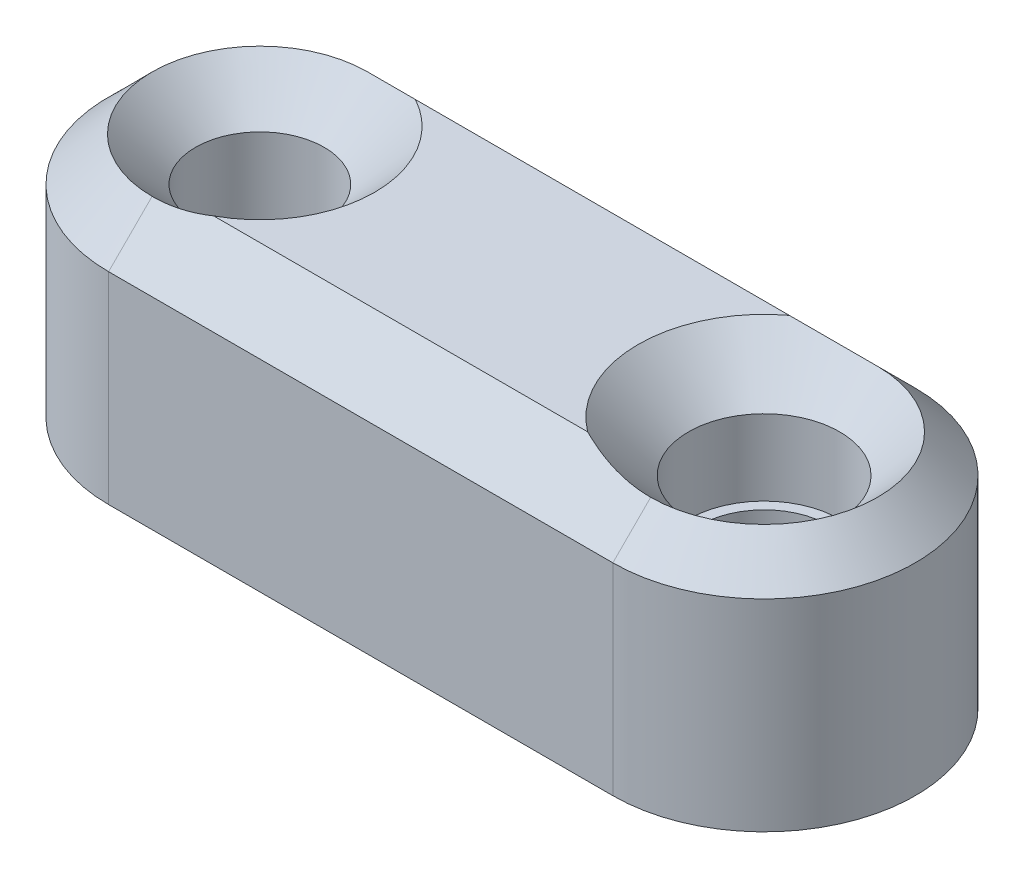
ISO-10303-21;
HEADER;
FILE_DESCRIPTION(('STEP AP214'),'2;1');
FILE_NAME('part.step','',(''),(''),'','','');
FILE_SCHEMA(('AUTOMOTIVE_DESIGN { 1 0 10303 214 1 1 1 1 }'));
ENDSEC;
DATA;
#1=APPLICATION_CONTEXT('core data for automotive mechanical design processes');
#2=APPLICATION_PROTOCOL_DEFINITION('international standard','automotive_design',2000,#1);
#3=PRODUCT_CONTEXT('',#1,'mechanical');
#4=PRODUCT('Part','Part','',(#3));
#5=PRODUCT_RELATED_PRODUCT_CATEGORY('part','',(#4));
#6=PRODUCT_DEFINITION_FORMATION('','',#4);
#7=PRODUCT_DEFINITION_CONTEXT('part definition',#1,'design');
#8=PRODUCT_DEFINITION('design','',#6,#7);
#9=PRODUCT_DEFINITION_SHAPE('','',#8);
#10=(LENGTH_UNIT() NAMED_UNIT(*) SI_UNIT(.MILLI.,.METRE.));
#11=(NAMED_UNIT(*) PLANE_ANGLE_UNIT() SI_UNIT($,.RADIAN.));
#12=(NAMED_UNIT(*) SI_UNIT($,.STERADIAN.) SOLID_ANGLE_UNIT());
#13=UNCERTAINTY_MEASURE_WITH_UNIT(LENGTH_MEASURE(1.E-05),#10,'distance_accuracy_value','');
#14=(GEOMETRIC_REPRESENTATION_CONTEXT(3) GLOBAL_UNCERTAINTY_ASSIGNED_CONTEXT((#13)) GLOBAL_UNIT_ASSIGNED_CONTEXT((#10,
#11,#12)) REPRESENTATION_CONTEXT('',''));
#15=CARTESIAN_POINT('',(0.,0.,0.));
#16=DIRECTION('',(0.,0.,1.));
#17=DIRECTION('',(1.,0.,0.));
#18=AXIS2_PLACEMENT_3D('',#15,#16,#17);
#19=CARTESIAN_POINT('',(0.,10.,0.));
#20=DIRECTION('',(0.,-1.,0.));
#21=DIRECTION('',(0.,0.,-1.));
#22=AXIS2_PLACEMENT_3D('',#19,#20,#21);
#23=CYLINDRICAL_SURFACE('',#22,6.);
#24=DIRECTION('',(0.,-1.,0.));
#25=VECTOR('',#24,1.);
#26=CARTESIAN_POINT('',(0.,10.,6.));
#27=LINE('',#26,#25);
#28=CARTESIAN_POINT('',(0.,7.99999999999999,6.));
#29=VERTEX_POINT('',#28);
#30=CARTESIAN_POINT('',(0.,0.,6.));
#31=VERTEX_POINT('',#30);
#32=EDGE_CURVE('E97',#29,#31,#27,.T.);
#33=ORIENTED_EDGE('',*,*,#32,.F.);
#34=CARTESIAN_POINT('',(0.,7.99999999999999,0.));
#35=DIRECTION('',(0.,1.,0.));
#36=DIRECTION('',(0.,0.,1.));
#37=AXIS2_PLACEMENT_3D('',#34,#35,#36);
#38=CIRCLE('',#37,6.);
#39=CARTESIAN_POINT('',(0.,7.99999999999999,-6.));
#40=VERTEX_POINT('',#39);
#41=EDGE_CURVE('E177',#29,#40,#38,.F.);
#42=ORIENTED_EDGE('',*,*,#41,.T.);
#43=DIRECTION('',(0.,-1.,0.));
#44=VECTOR('',#43,1.);
#45=CARTESIAN_POINT('',(0.,10.,-6.));
#46=LINE('',#45,#44);
#47=CARTESIAN_POINT('',(0.,0.,-6.));
#48=VERTEX_POINT('',#47);
#49=EDGE_CURVE('E153',#40,#48,#46,.T.);
#50=ORIENTED_EDGE('',*,*,#49,.T.);
#51=CARTESIAN_POINT('',(0.,0.,0.));
#52=DIRECTION('',(0.,1.,0.));
#53=DIRECTION('',(0.,0.,1.));
#54=AXIS2_PLACEMENT_3D('',#51,#52,#53);
#55=CIRCLE('',#54,6.);
#56=EDGE_CURVE('E282',#48,#31,#55,.T.);
#57=ORIENTED_EDGE('',*,*,#56,.T.);
#58=EDGE_LOOP('',(#33,#42,#50,#57));
#59=FACE_BOUND('',#58,.T.);
#60=ADVANCED_FACE('F44',(#59),#23,.T.);
#61=CARTESIAN_POINT('',(0.,10.,6.));
#62=DIRECTION('',(0.,0.,-1.));
#63=DIRECTION('',(-1.,0.,0.));
#64=AXIS2_PLACEMENT_3D('',#61,#62,#63);
#65=PLANE('',#64);
#66=DIRECTION('',(0.,-1.,0.));
#67=VECTOR('',#66,1.);
#68=CARTESIAN_POINT('',(20.,10.,6.));
#69=LINE('',#68,#67);
#70=CARTESIAN_POINT('',(20.,7.99999999999999,6.));
#71=VERTEX_POINT('',#70);
#72=CARTESIAN_POINT('',(20.,0.,6.));
#73=VERTEX_POINT('',#72);
#74=EDGE_CURVE('E160',#71,#73,#69,.T.);
#75=ORIENTED_EDGE('',*,*,#74,.F.);
#76=DIRECTION('',(-1.,0.,0.));
#77=VECTOR('',#76,1.);
#78=CARTESIAN_POINT('',(0.,7.99999999999999,6.));
#79=LINE('',#78,#77);
#80=EDGE_CURVE('E71',#71,#29,#79,.T.);
#81=ORIENTED_EDGE('',*,*,#80,.T.);
#82=ORIENTED_EDGE('',*,*,#32,.T.);
#83=DIRECTION('',(1.,0.,0.));
#84=VECTOR('',#83,1.);
#85=CARTESIAN_POINT('',(0.,0.,6.));
#86=LINE('',#85,#84);
#87=EDGE_CURVE('E285',#31,#73,#86,.T.);
#88=ORIENTED_EDGE('',*,*,#87,.T.);
#89=EDGE_LOOP('',(#75,#81,#82,#88));
#90=FACE_BOUND('',#89,.T.);
#91=ADVANCED_FACE('F318',(#90),#65,.F.);
#92=CARTESIAN_POINT('',(20.,10.,0.));
#93=DIRECTION('',(0.,-1.,0.));
#94=DIRECTION('',(0.,0.,-1.));
#95=AXIS2_PLACEMENT_3D('',#92,#93,#94);
#96=CYLINDRICAL_SURFACE('',#95,6.);
#97=DIRECTION('',(0.,-1.,0.));
#98=VECTOR('',#97,1.);
#99=CARTESIAN_POINT('',(20.,10.,-6.));
#100=LINE('',#99,#98);
#101=CARTESIAN_POINT('',(20.,7.99999999999999,-6.));
#102=VERTEX_POINT('',#101);
#103=CARTESIAN_POINT('',(20.,0.,-6.));
#104=VERTEX_POINT('',#103);
#105=EDGE_CURVE('E151',#102,#104,#100,.T.);
#106=ORIENTED_EDGE('',*,*,#105,.F.);
#107=CARTESIAN_POINT('',(20.,7.99999999999999,0.));
#108=DIRECTION('',(0.,1.,0.));
#109=DIRECTION('',(0.,0.,1.));
#110=AXIS2_PLACEMENT_3D('',#107,#108,#109);
#111=CIRCLE('',#110,6.);
#112=EDGE_CURVE('E143',#102,#71,#111,.F.);
#113=ORIENTED_EDGE('',*,*,#112,.T.);
#114=ORIENTED_EDGE('',*,*,#74,.T.);
#115=CARTESIAN_POINT('',(20.,0.,0.));
#116=DIRECTION('',(0.,1.,0.));
#117=DIRECTION('',(0.,0.,1.));
#118=AXIS2_PLACEMENT_3D('',#115,#116,#117);
#119=CIRCLE('',#118,6.);
#120=EDGE_CURVE('E158',#73,#104,#119,.T.);
#121=ORIENTED_EDGE('',*,*,#120,.T.);
#122=EDGE_LOOP('',(#106,#113,#114,#121));
#123=FACE_BOUND('',#122,.T.);
#124=ADVANCED_FACE('F156',(#123),#96,.T.);
#125=CARTESIAN_POINT('',(0.,10.,-6.));
#126=DIRECTION('',(0.,0.,1.));
#127=DIRECTION('',(1.,0.,0.));
#128=AXIS2_PLACEMENT_3D('',#125,#126,#127);
#129=PLANE('',#128);
#130=ORIENTED_EDGE('',*,*,#49,.F.);
#131=DIRECTION('',(1.,0.,0.));
#132=VECTOR('',#131,1.);
#133=CARTESIAN_POINT('',(20.,7.99999999999999,-6.));
#134=LINE('',#133,#132);
#135=EDGE_CURVE('E135',#40,#102,#134,.T.);
#136=ORIENTED_EDGE('',*,*,#135,.T.);
#137=ORIENTED_EDGE('',*,*,#105,.T.);
#138=DIRECTION('',(-1.,0.,0.));
#139=VECTOR('',#138,1.);
#140=CARTESIAN_POINT('',(0.,0.,-6.));
#141=LINE('',#140,#139);
#142=EDGE_CURVE('E163',#104,#48,#141,.T.);
#143=ORIENTED_EDGE('',*,*,#142,.T.);
#144=EDGE_LOOP('',(#130,#136,#137,#143));
#145=FACE_BOUND('',#144,.T.);
#146=ADVANCED_FACE('F149',(#145),#129,.F.);
#147=CARTESIAN_POINT('',(0.,10.,0.));
#148=DIRECTION('',(0.,1.,0.));
#149=DIRECTION('',(0.,0.,1.));
#150=AXIS2_PLACEMENT_3D('',#147,#148,#149);
#151=PLANE('',#150);
#152=DIRECTION('',(-1.,0.,0.));
#153=VECTOR('',#152,1.);
#154=CARTESIAN_POINT('',(0.,10.,-3.99999999999999));
#155=LINE('',#154,#153);
#156=CARTESIAN_POINT('',(17.,10.,-3.99999999999999));
#157=VERTEX_POINT('',#156);
#158=CARTESIAN_POINT('',(2.16852484422016,10.,-3.99999999999999));
#159=VERTEX_POINT('',#158);
#160=EDGE_CURVE('E172',#157,#159,#155,.T.);
#161=ORIENTED_EDGE('',*,*,#160,.T.);
#162=CARTESIAN_POINT('',(0.,10.,0.));
#163=DIRECTION('',(0.,1.,0.));
#164=DIRECTION('',(0.,0.,1.));
#165=AXIS2_PLACEMENT_3D('',#162,#163,#164);
#166=CIRCLE('',#165,4.55);
#167=CARTESIAN_POINT('',(2.16852484422016,10.,3.99999999999999));
#168=VERTEX_POINT('',#167);
#169=EDGE_CURVE('E154',#159,#168,#166,.F.);
#170=ORIENTED_EDGE('',*,*,#169,.T.);
#171=DIRECTION('',(1.,0.,0.));
#172=VECTOR('',#171,1.);
#173=CARTESIAN_POINT('',(20.,10.,3.99999999999999));
#174=LINE('',#173,#172);
#175=CARTESIAN_POINT('',(17.,10.,3.99999999999999));
#176=VERTEX_POINT('',#175);
#177=EDGE_CURVE('E170',#168,#176,#174,.T.);
#178=ORIENTED_EDGE('',*,*,#177,.T.);
#179=CARTESIAN_POINT('',(20.,10.,0.));
#180=DIRECTION('',(0.,1.,0.));
#181=DIRECTION('',(0.,0.,1.));
#182=AXIS2_PLACEMENT_3D('',#179,#180,#181);
#183=CIRCLE('',#182,5.);
#184=EDGE_CURVE('E168',#176,#157,#183,.F.);
#185=ORIENTED_EDGE('',*,*,#184,.T.);
#186=EDGE_LOOP('',(#161,#170,#178,#185));
#187=FACE_BOUND('',#186,.T.);
#188=ADVANCED_FACE('F302',(#187),#151,.T.);
#189=CARTESIAN_POINT('',(0.,0.,0.));
#190=DIRECTION('',(0.,1.,0.));
#191=DIRECTION('',(0.,0.,1.));
#192=AXIS2_PLACEMENT_3D('',#189,#190,#191);
#193=PLANE('',#192);
#194=DIRECTION('',(1.,0.,0.));
#195=VECTOR('',#194,1.);
#196=CARTESIAN_POINT('',(-2.10732848254214,0.,-3.65));
#197=LINE('',#196,#195);
#198=CARTESIAN_POINT('',(-2.10732848254214,0.,-3.65));
#199=VERTEX_POINT('',#198);
#200=CARTESIAN_POINT('',(2.10732848254213,0.,-3.65));
#201=VERTEX_POINT('',#200);
#202=EDGE_CURVE('E578',#199,#201,#197,.T.);
#203=ORIENTED_EDGE('',*,*,#202,.F.);
#204=DIRECTION('',(0.5,0.,-0.866025403784439));
#205=VECTOR('',#204,1.);
#206=CARTESIAN_POINT('',(-4.21465696508427,0.,0.));
#207=LINE('',#206,#205);
#208=CARTESIAN_POINT('',(-4.21465696508427,0.,0.));
#209=VERTEX_POINT('',#208);
#210=EDGE_CURVE('E62',#209,#199,#207,.T.);
#211=ORIENTED_EDGE('',*,*,#210,.F.);
#212=DIRECTION('',(-0.5,0.,-0.866025403784439));
#213=VECTOR('',#212,1.);
#214=CARTESIAN_POINT('',(-2.10732848254213,0.,3.65));
#215=LINE('',#214,#213);
#216=CARTESIAN_POINT('',(-2.10732848254213,0.,3.65));
#217=VERTEX_POINT('',#216);
#218=EDGE_CURVE('E561',#217,#209,#215,.T.);
#219=ORIENTED_EDGE('',*,*,#218,.F.);
#220=DIRECTION('',(-1.,0.,0.));
#221=VECTOR('',#220,1.);
#222=CARTESIAN_POINT('',(2.10732848254214,0.,3.65));
#223=LINE('',#222,#221);
#224=CARTESIAN_POINT('',(2.10732848254214,0.,3.65));
#225=VERTEX_POINT('',#224);
#226=EDGE_CURVE('E566',#225,#217,#223,.T.);
#227=ORIENTED_EDGE('',*,*,#226,.F.);
#228=DIRECTION('',(-0.5,0.,0.866025403784439));
#229=VECTOR('',#228,1.);
#230=CARTESIAN_POINT('',(4.21465696508427,0.,0.));
#231=LINE('',#230,#229);
#232=CARTESIAN_POINT('',(4.21465696508427,0.,0.));
#233=VERTEX_POINT('',#232);
#234=EDGE_CURVE('E584',#233,#225,#231,.T.);
#235=ORIENTED_EDGE('',*,*,#234,.F.);
#236=DIRECTION('',(0.5,0.,0.866025403784439));
#237=VECTOR('',#236,1.);
#238=CARTESIAN_POINT('',(2.10732848254213,0.,-3.65));
#239=LINE('',#238,#237);
#240=EDGE_CURVE('E581',#201,#233,#239,.T.);
#241=ORIENTED_EDGE('',*,*,#240,.F.);
#242=EDGE_LOOP('',(#203,#211,#219,#227,#235,#241));
#243=FACE_BOUND('',#242,.T.);
#244=CARTESIAN_POINT('',(20.,0.,0.));
#245=DIRECTION('',(0.,1.,0.));
#246=DIRECTION('',(0.,0.,1.));
#247=AXIS2_PLACEMENT_3D('',#244,#245,#246);
#248=CIRCLE('',#247,2.575);
#249=CARTESIAN_POINT('',(20.,0.,2.575));
#250=VERTEX_POINT('',#249);
#251=EDGE_CURVE('E275',#250,#250,#248,.T.);
#252=ORIENTED_EDGE('',*,*,#251,.T.);
#253=EDGE_LOOP('',(#252));
#254=FACE_BOUND('',#253,.T.);
#255=ORIENTED_EDGE('',*,*,#56,.F.);
#256=ORIENTED_EDGE('',*,*,#142,.F.);
#257=ORIENTED_EDGE('',*,*,#120,.F.);
#258=ORIENTED_EDGE('',*,*,#87,.F.);
#259=EDGE_LOOP('',(#255,#256,#257,#258));
#260=FACE_BOUND('',#259,.T.);
#261=ADVANCED_FACE('F289',(#243,#254,#260),#193,.F.);
#262=CARTESIAN_POINT('',(0.,0.,0.));
#263=DIRECTION('',(0.,-1.,0.));
#264=DIRECTION('',(0.,0.,-1.));
#265=AXIS2_PLACEMENT_3D('',#262,#263,#264);
#266=CYLINDRICAL_SURFACE('',#265,2.55);
#267=CARTESIAN_POINT('',(0.,7.99999999999999,0.));
#268=DIRECTION('',(0.,1.,0.));
#269=DIRECTION('',(0.,0.,1.));
#270=AXIS2_PLACEMENT_3D('',#267,#268,#269);
#271=CIRCLE('',#270,2.55);
#272=CARTESIAN_POINT('',(0.,7.99999999999999,2.55));
#273=VERTEX_POINT('',#272);
#274=EDGE_CURVE('E54',#273,#273,#271,.T.);
#275=ORIENTED_EDGE('',*,*,#274,.T.);
#276=EDGE_LOOP('',(#275));
#277=FACE_BOUND('',#276,.T.);
#278=CARTESIAN_POINT('',(0.,5.,0.));
#279=DIRECTION('',(0.,-1.,0.));
#280=DIRECTION('',(0.,0.,-1.));
#281=AXIS2_PLACEMENT_3D('',#278,#279,#280);
#282=CIRCLE('',#281,2.55);
#283=CARTESIAN_POINT('',(0.,5.,-2.55));
#284=VERTEX_POINT('',#283);
#285=EDGE_CURVE('E184',#284,#284,#282,.T.);
#286=ORIENTED_EDGE('',*,*,#285,.T.);
#287=EDGE_LOOP('',(#286));
#288=FACE_BOUND('',#287,.T.);
#289=ADVANCED_FACE('F312',(#277,#288),#266,.F.);
#290=CARTESIAN_POINT('',(20.,10.,0.));
#291=DIRECTION('',(0.,1.,0.));
#292=DIRECTION('',(0.,0.,1.));
#293=AXIS2_PLACEMENT_3D('',#290,#291,#292);
#294=CYLINDRICAL_SURFACE('',#293,2.575);
#295=ORIENTED_EDGE('',*,*,#251,.F.);
#296=EDGE_LOOP('',(#295));
#297=FACE_BOUND('',#296,.T.);
#298=CARTESIAN_POINT('',(20.,5.,0.));
#299=DIRECTION('',(0.,1.,0.));
#300=DIRECTION('',(0.,0.,1.));
#301=AXIS2_PLACEMENT_3D('',#298,#299,#300);
#302=CIRCLE('',#301,2.575);
#303=CARTESIAN_POINT('',(20.,5.,2.575));
#304=VERTEX_POINT('',#303);
#305=EDGE_CURVE('E270',#304,#304,#302,.T.);
#306=ORIENTED_EDGE('',*,*,#305,.T.);
#307=EDGE_LOOP('',(#306));
#308=FACE_BOUND('',#307,.T.);
#309=ADVANCED_FACE('F357',(#297,#308),#294,.F.);
#310=CARTESIAN_POINT('',(17.425,5.,0.));
#311=DIRECTION('',(0.,-1.,0.));
#312=DIRECTION('',(0.,0.,-1.));
#313=AXIS2_PLACEMENT_3D('',#310,#311,#312);
#314=PLANE('',#313);
#315=ORIENTED_EDGE('',*,*,#305,.F.);
#316=EDGE_LOOP('',(#315));
#317=FACE_BOUND('',#316,.T.);
#318=CARTESIAN_POINT('',(20.,5.,0.));
#319=DIRECTION('',(0.,1.,0.));
#320=DIRECTION('',(0.,0.,1.));
#321=AXIS2_PLACEMENT_3D('',#318,#319,#320);
#322=CIRCLE('',#321,3.);
#323=CARTESIAN_POINT('',(20.,5.,3.));
#324=VERTEX_POINT('',#323);
#325=EDGE_CURVE('E268',#324,#324,#322,.T.);
#326=ORIENTED_EDGE('',*,*,#325,.T.);
#327=EDGE_LOOP('',(#326));
#328=FACE_BOUND('',#327,.T.);
#329=ADVANCED_FACE('F368',(#317,#328),#314,.F.);
#330=CARTESIAN_POINT('',(20.,10.,0.));
#331=DIRECTION('',(0.,1.,0.));
#332=DIRECTION('',(0.,0.,1.));
#333=AXIS2_PLACEMENT_3D('',#330,#331,#332);
#334=CYLINDRICAL_SURFACE('',#333,3.);
#335=CARTESIAN_POINT('',(20.,8.,0.));
#336=DIRECTION('',(0.,1.,0.));
#337=DIRECTION('',(0.,0.,1.));
#338=AXIS2_PLACEMENT_3D('',#335,#336,#337);
#339=CIRCLE('',#338,3.);
#340=CARTESIAN_POINT('',(20.,8.,3.));
#341=VERTEX_POINT('',#340);
#342=EDGE_CURVE('E11',#341,#341,#339,.T.);
#343=ORIENTED_EDGE('',*,*,#342,.T.);
#344=EDGE_LOOP('',(#343));
#345=FACE_BOUND('',#344,.T.);
#346=ORIENTED_EDGE('',*,*,#325,.F.);
#347=EDGE_LOOP('',(#346));
#348=FACE_BOUND('',#347,.T.);
#349=ADVANCED_FACE('F241',(#345,#348),#334,.F.);
#350=CARTESIAN_POINT('',(0.,10.,3.99999999999999));
#351=DIRECTION('',(0.,0.707106781186546,0.707106781186549));
#352=DIRECTION('',(-1.,0.,0.));
#353=AXIS2_PLACEMENT_3D('',#350,#351,#352);
#354=PLANE('',#353);
#355=DIRECTION('',(0.,0.707106781186549,-0.707106781186546));
#356=VECTOR('',#355,1.);
#357=CARTESIAN_POINT('',(0.,7.99999999999999,6.));
#358=LINE('',#357,#356);
#359=CARTESIAN_POINT('',(0.,9.72499999999999,4.275));
#360=VERTEX_POINT('',#359);
#361=EDGE_CURVE('E141',#29,#360,#358,.T.);
#362=ORIENTED_EDGE('',*,*,#361,.F.);
#363=ORIENTED_EDGE('',*,*,#80,.F.);
#364=DIRECTION('',(0.,-0.707106781186549,0.707106781186546));
#365=VECTOR('',#364,1.);
#366=CARTESIAN_POINT('',(20.,10.,3.99999999999999));
#367=LINE('',#366,#365);
#368=CARTESIAN_POINT('',(20.,9.49999999999999,4.5));
#369=VERTEX_POINT('',#368);
#370=EDGE_CURVE('E49',#369,#71,#367,.T.);
#371=ORIENTED_EDGE('',*,*,#370,.F.);
#372=CARTESIAN_POINT('',(20.0002,9.50000000222222,4.49999999777777));
#373=CARTESIAN_POINT('',(19.9080854621866,9.49999586524942,4.50000413475057));
#374=CARTESIAN_POINT('',(19.8159829638533,9.50141056231574,4.49858943768425));
#375=CARTESIAN_POINT('',(19.6319563414573,9.50705529907127,4.49294470092872));
#376=CARTESIAN_POINT('',(19.5400322064634,9.51128516039035,4.48871483960964));
#377=CARTESIAN_POINT('',(19.2648932268283,9.52815495897955,4.47184504102044));
#378=CARTESIAN_POINT('',(19.0821587597806,9.54497518150629,4.4550248184937));
#379=CARTESIAN_POINT('',(18.7222701658679,9.58892828310185,4.41107171689814));
#380=CARTESIAN_POINT('',(18.5450735699906,9.61589049163609,4.3841095083639));
#381=CARTESIAN_POINT('',(18.1942081956219,9.67945071400616,4.32054928599383));
#382=CARTESIAN_POINT('',(18.0205388935382,9.71604728628695,4.28395271371305));
#383=CARTESIAN_POINT('',(17.7046996317831,9.79153179855835,4.20846820144164));
#384=CARTESIAN_POINT('',(17.5619070870562,9.82913298848376,4.17086701151623));
#385=CARTESIAN_POINT('',(17.2786006735324,9.91032142455598,4.08967857544401));
#386=CARTESIAN_POINT('',(17.1381096304699,9.95394857496788,4.04605142503212));
#387=CARTESIAN_POINT('',(16.999400059988,10.0002,3.99980000000001));
#388=B_SPLINE_CURVE_WITH_KNOTS('',3,(#372,#373,#374,#375,#376,#377,#378,#379,#380,#381,#382,
#383,#384,#385,#386,#387),.UNSPECIFIED.,.F.,.F.,(4,2,2,2,2,2,2,4),(0.,0.27629812161126,
0.552578738509698,1.10468237817214,1.64788307061312,2.19100253204588,2.64787427142779,
3.10793108880481),.UNSPECIFIED.);
#389=EDGE_CURVE('E252',#176,#369,#388,.F.);
#390=ORIENTED_EDGE('',*,*,#389,.F.);
#391=ORIENTED_EDGE('',*,*,#177,.F.);
#392=CARTESIAN_POINT('',(2.16931325538755,10.0002,3.99979999999999));
#393=CARTESIAN_POINT('',(2.08214712181107,9.9780833995769,4.02191660042309));
#394=CARTESIAN_POINT('',(1.9943855305117,9.95715052308095,4.04284947691904));
#395=CARTESIAN_POINT('',(1.81774078951472,9.91777073655854,4.08222926344146));
#396=CARTESIAN_POINT('',(1.72885747854478,9.89932418855493,4.10067581144506));
#397=CARTESIAN_POINT('',(1.46204820078483,9.84816579500427,4.15183420499572));
#398=CARTESIAN_POINT('',(1.28261363622156,9.81929008465818,4.18070991534181));
#399=CARTESIAN_POINT('',(0.920726035542081,9.77266037495721,4.22733962504279));
#400=CARTESIAN_POINT('',(0.738271095646308,9.75491368739726,4.24508631260273));
#401=CARTESIAN_POINT('',(0.462803246727794,9.73702644944949,4.2629735505505));
#402=CARTESIAN_POINT('',(0.370325833995576,9.7325192242261,4.26748077577389));
#403=CARTESIAN_POINT('',(0.185169762060039,9.72650344700515,4.27349655299484));
#404=CARTESIAN_POINT('',(0.0924910889590925,9.72499510913707,4.27500489086292));
#405=CARTESIAN_POINT('',(-0.000199999999999763,9.72500000233918,4.27499999766082));
#406=B_SPLINE_CURVE_WITH_KNOTS('',3,(#392,#393,#394,#395,#396,#397,#398,#399,#400,#401,#402,
#403,#404,#405),.UNSPECIFIED.,.F.,.F.,(4,2,2,2,2,2,4),(0.,0.277793680661289,0.55562776598742,
1.10700442014541,1.65874295161531,1.93674742076174,2.21477173954134),.UNSPECIFIED.);
#407=EDGE_CURVE('E245',#360,#168,#406,.F.);
#408=ORIENTED_EDGE('',*,*,#407,.F.);
#409=EDGE_LOOP('',(#362,#363,#371,#390,#391,#408));
#410=FACE_BOUND('',#409,.T.);
#411=ADVANCED_FACE('F234',(#410),#354,.T.);
#412=CARTESIAN_POINT('',(20.,10.,0.));
#413=DIRECTION('',(0.,-1.,0.));
#414=DIRECTION('',(0.,0.,-1.));
#415=AXIS2_PLACEMENT_3D('',#412,#413,#414);
#416=CONICAL_SURFACE('',#415,3.99999999999999,0.785398163397447);
#417=CARTESIAN_POINT('',(20.,9.49999999999999,0.));
#418=DIRECTION('',(0.,1.,0.));
#419=DIRECTION('',(0.,0.,1.));
#420=AXIS2_PLACEMENT_3D('',#417,#418,#419);
#421=CIRCLE('',#420,4.5);
#422=CARTESIAN_POINT('',(20.,9.49999999999999,-4.5));
#423=VERTEX_POINT('',#422);
#424=EDGE_CURVE('E258',#369,#423,#421,.T.);
#425=ORIENTED_EDGE('',*,*,#424,.F.);
#426=ORIENTED_EDGE('',*,*,#370,.T.);
#427=ORIENTED_EDGE('',*,*,#112,.F.);
#428=DIRECTION('',(0.,-0.707106781186549,-0.707106781186546));
#429=VECTOR('',#428,1.);
#430=CARTESIAN_POINT('',(20.,10.,-3.99999999999999));
#431=LINE('',#430,#429);
#432=EDGE_CURVE('E130',#423,#102,#431,.T.);
#433=ORIENTED_EDGE('',*,*,#432,.F.);
#434=EDGE_LOOP('',(#425,#426,#427,#433));
#435=FACE_BOUND('',#434,.T.);
#436=ADVANCED_FACE('F47',(#435),#416,.T.);
#437=CARTESIAN_POINT('',(20.,8.,0.));
#438=DIRECTION('',(0.,1.,0.));
#439=DIRECTION('',(0.,0.,1.));
#440=AXIS2_PLACEMENT_3D('',#437,#438,#439);
#441=CONICAL_SURFACE('',#440,3.,0.78539816339745);
#442=ORIENTED_EDGE('',*,*,#342,.F.);
#443=EDGE_LOOP('',(#442));
#444=FACE_BOUND('',#443,.T.);
#445=ORIENTED_EDGE('',*,*,#389,.T.);
#446=ORIENTED_EDGE('',*,*,#424,.T.);
#447=CARTESIAN_POINT('',(16.999400059988,10.0002,-3.99979999999999));
#448=CARTESIAN_POINT('',(17.098210939336,9.96725704521721,-4.03274295478279));
#449=CARTESIAN_POINT('',(17.1979028369949,9.93564703368854,-4.06435296631145));
#450=CARTESIAN_POINT('',(17.3990242615122,9.87527509892903,-4.12472490107097));
#451=CARTESIAN_POINT('',(17.500454213104,9.84651388385406,-4.15348611614593));
#452=CARTESIAN_POINT('',(17.8076451908635,9.76469262431896,-4.23530737568104));
#453=CARTESIAN_POINT('',(18.0159156632829,9.71622695239017,-4.28377304760982));
#454=CARTESIAN_POINT('',(18.4333369630417,9.63398934223891,-4.36601065776108));
#455=CARTESIAN_POINT('',(18.6423715671244,9.59992258442263,-4.40007741557736));
#456=CARTESIAN_POINT('',(19.0639032402708,9.54622116535354,-4.45377883464645));
#457=CARTESIAN_POINT('',(19.2763950203948,9.5265662534198,-4.4734337465802));
#458=CARTESIAN_POINT('',(19.574395153558,9.5096628605238,-4.4903371394762));
#459=CARTESIAN_POINT('',(19.6592510947641,9.50604959979397,-4.49395040020602));
#460=CARTESIAN_POINT('',(19.8294663358548,9.50121178280442,-4.49878821719558));
#461=CARTESIAN_POINT('',(19.9148262261058,9.49999761872997,-4.50000238127002));
#462=CARTESIAN_POINT('',(20.0002,9.50000000222222,-4.49999999777777));
#463=B_SPLINE_CURVE_WITH_KNOTS('',3,(#447,#448,#449,#450,#451,#452,#453,#454,#455,#456,#457,
#458,#459,#460,#461,#462),.UNSPECIFIED.,.F.,.F.,(4,2,2,2,2,2,2,4),(0.,0.327690444811376,
0.655462143791038,1.31230322725873,1.95495408849705,2.59670019481773,2.85167456853162,
3.10775101629689),.UNSPECIFIED.);
#464=EDGE_CURVE('E139',#157,#423,#463,.T.);
#465=ORIENTED_EDGE('',*,*,#464,.F.);
#466=ORIENTED_EDGE('',*,*,#184,.F.);
#467=EDGE_LOOP('',(#445,#446,#465,#466));
#468=FACE_BOUND('',#467,.T.);
#469=ADVANCED_FACE('F209',(#444,#468),#441,.F.);
#470=CARTESIAN_POINT('',(0.,10.,0.));
#471=DIRECTION('',(0.,1.,0.));
#472=DIRECTION('',(0.,0.,1.));
#473=AXIS2_PLACEMENT_3D('',#470,#471,#472);
#474=CONICAL_SURFACE('',#473,4.55,0.785398163397447);
#475=ORIENTED_EDGE('',*,*,#274,.F.);
#476=EDGE_LOOP('',(#475));
#477=FACE_BOUND('',#476,.T.);
#478=CARTESIAN_POINT('',(0.,9.72499999999999,0.));
#479=DIRECTION('',(0.,1.,0.));
#480=DIRECTION('',(0.,0.,1.));
#481=AXIS2_PLACEMENT_3D('',#478,#479,#480);
#482=CIRCLE('',#481,4.275);
#483=CARTESIAN_POINT('',(0.,9.72499999999999,-4.275));
#484=VERTEX_POINT('',#483);
#485=EDGE_CURVE('E295',#360,#484,#482,.F.);
#486=ORIENTED_EDGE('',*,*,#485,.F.);
#487=ORIENTED_EDGE('',*,*,#407,.T.);
#488=ORIENTED_EDGE('',*,*,#169,.F.);
#489=CARTESIAN_POINT('',(-0.0002,9.72500000233918,-4.27499999766082));
#490=CARTESIAN_POINT('',(0.0924910889590921,9.72499510913707,-4.27500489086292));
#491=CARTESIAN_POINT('',(0.185169762060039,9.72650344700515,-4.27349655299484));
#492=CARTESIAN_POINT('',(0.370325833995576,9.7325192242261,-4.26748077577389));
#493=CARTESIAN_POINT('',(0.462803246727794,9.73702644944949,-4.2629735505505));
#494=CARTESIAN_POINT('',(0.738271095646308,9.75491368739726,-4.24508631260273));
#495=CARTESIAN_POINT('',(0.920726035542081,9.77266037495721,-4.22733962504279));
#496=CARTESIAN_POINT('',(1.28261363622156,9.81929008465818,-4.18070991534181));
#497=CARTESIAN_POINT('',(1.46204820078483,9.84816579500428,-4.15183420499572));
#498=CARTESIAN_POINT('',(1.72885747854478,9.89932418855493,-4.10067581144506));
#499=CARTESIAN_POINT('',(1.81774078951472,9.91777073655854,-4.08222926344146));
#500=CARTESIAN_POINT('',(1.9943855305117,9.95715052308095,-4.04284947691904));
#501=CARTESIAN_POINT('',(2.08214712181107,9.9780833995769,-4.02191660042309));
#502=CARTESIAN_POINT('',(2.16931325538755,10.0002,-3.99979999999999));
#503=B_SPLINE_CURVE_WITH_KNOTS('',3,(#489,#490,#491,#492,#493,#494,#495,#496,#497,#498,#499,
#500,#501,#502),.UNSPECIFIED.,.F.,.F.,(4,2,2,2,2,2,4),(0.,0.278024318779591,0.556028787926024,
1.10776731939593,1.65914397355392,1.93697805888005,2.21477173954134),.UNSPECIFIED.);
#504=EDGE_CURVE('E183',#484,#159,#503,.T.);
#505=ORIENTED_EDGE('',*,*,#504,.F.);
#506=EDGE_LOOP('',(#486,#487,#488,#505));
#507=FACE_BOUND('',#506,.T.);
#508=ADVANCED_FACE('F202',(#477,#507),#474,.F.);
#509=CARTESIAN_POINT('',(0.,10.,0.));
#510=DIRECTION('',(0.,-1.,0.));
#511=DIRECTION('',(0.,0.,-1.));
#512=AXIS2_PLACEMENT_3D('',#509,#510,#511);
#513=CONICAL_SURFACE('',#512,3.99999999999999,0.785398163397447);
#514=ORIENTED_EDGE('',*,*,#361,.T.);
#515=ORIENTED_EDGE('',*,*,#485,.T.);
#516=DIRECTION('',(0.,0.707106781186549,0.707106781186546));
#517=VECTOR('',#516,1.);
#518=CARTESIAN_POINT('',(0.,7.99999999999999,-6.));
#519=LINE('',#518,#517);
#520=EDGE_CURVE('E181',#40,#484,#519,.T.);
#521=ORIENTED_EDGE('',*,*,#520,.F.);
#522=ORIENTED_EDGE('',*,*,#41,.F.);
#523=EDGE_LOOP('',(#514,#515,#521,#522));
#524=FACE_BOUND('',#523,.T.);
#525=ADVANCED_FACE('F208',(#524),#513,.T.);
#526=CARTESIAN_POINT('',(0.,10.,-3.99999999999999));
#527=DIRECTION('',(0.,0.707106781186546,-0.707106781186549));
#528=DIRECTION('',(1.,0.,0.));
#529=AXIS2_PLACEMENT_3D('',#526,#527,#528);
#530=PLANE('',#529);
#531=ORIENTED_EDGE('',*,*,#432,.T.);
#532=ORIENTED_EDGE('',*,*,#135,.F.);
#533=ORIENTED_EDGE('',*,*,#520,.T.);
#534=ORIENTED_EDGE('',*,*,#504,.T.);
#535=ORIENTED_EDGE('',*,*,#160,.F.);
#536=ORIENTED_EDGE('',*,*,#464,.T.);
#537=EDGE_LOOP('',(#531,#532,#533,#534,#535,#536));
#538=FACE_BOUND('',#537,.T.);
#539=ADVANCED_FACE('F132',(#538),#530,.T.);
#540=CARTESIAN_POINT('',(-4.21465696508427,5.,0.));
#541=DIRECTION('',(-0.866025403784439,0.,-0.5));
#542=DIRECTION('',(-0.5,0.,0.866025403784439));
#543=AXIS2_PLACEMENT_3D('',#540,#541,#542);
#544=PLANE('',#543);
#545=ORIENTED_EDGE('',*,*,#210,.T.);
#546=DIRECTION('',(0.,-1.,0.));
#547=VECTOR('',#546,1.);
#548=CARTESIAN_POINT('',(-2.10732848254214,5.,-3.65));
#549=LINE('',#548,#547);
#550=CARTESIAN_POINT('',(-2.10732848254214,5.,-3.65));
#551=VERTEX_POINT('',#550);
#552=EDGE_CURVE('E576',#551,#199,#549,.T.);
#553=ORIENTED_EDGE('',*,*,#552,.F.);
#554=DIRECTION('',(0.5,0.,-0.866025403784439));
#555=VECTOR('',#554,1.);
#556=CARTESIAN_POINT('',(-4.21465696508427,5.,0.));
#557=LINE('',#556,#555);
#558=CARTESIAN_POINT('',(-4.21465696508427,5.,0.));
#559=VERTEX_POINT('',#558);
#560=EDGE_CURVE('E552',#559,#551,#557,.T.);
#561=ORIENTED_EDGE('',*,*,#560,.F.);
#562=DIRECTION('',(0.,-1.,0.));
#563=VECTOR('',#562,1.);
#564=CARTESIAN_POINT('',(-4.21465696508427,5.,0.));
#565=LINE('',#564,#563);
#566=EDGE_CURVE('E589',#559,#209,#565,.T.);
#567=ORIENTED_EDGE('',*,*,#566,.T.);
#568=EDGE_LOOP('',(#545,#553,#561,#567));
#569=FACE_BOUND('',#568,.T.);
#570=ADVANCED_FACE('F227',(#569),#544,.F.);
#571=CARTESIAN_POINT('',(-2.10732848254213,5.,3.65));
#572=DIRECTION('',(-0.866025403784439,0.,0.5));
#573=DIRECTION('',(0.5,0.,0.866025403784439));
#574=AXIS2_PLACEMENT_3D('',#571,#572,#573);
#575=PLANE('',#574);
#576=ORIENTED_EDGE('',*,*,#218,.T.);
#577=ORIENTED_EDGE('',*,*,#566,.F.);
#578=DIRECTION('',(-0.5,0.,-0.866025403784439));
#579=VECTOR('',#578,1.);
#580=CARTESIAN_POINT('',(-2.10732848254213,5.,3.65));
#581=LINE('',#580,#579);
#582=CARTESIAN_POINT('',(-2.10732848254213,5.,3.65));
#583=VERTEX_POINT('',#582);
#584=EDGE_CURVE('E559',#583,#559,#581,.T.);
#585=ORIENTED_EDGE('',*,*,#584,.F.);
#586=DIRECTION('',(0.,-1.,0.));
#587=VECTOR('',#586,1.);
#588=CARTESIAN_POINT('',(-2.10732848254213,5.,3.65));
#589=LINE('',#588,#587);
#590=EDGE_CURVE('E591',#583,#217,#589,.T.);
#591=ORIENTED_EDGE('',*,*,#590,.T.);
#592=EDGE_LOOP('',(#576,#577,#585,#591));
#593=FACE_BOUND('',#592,.T.);
#594=ADVANCED_FACE('F413',(#593),#575,.F.);
#595=CARTESIAN_POINT('',(2.10732848254214,5.,3.65));
#596=DIRECTION('',(0.,0.,1.));
#597=DIRECTION('',(1.,0.,0.));
#598=AXIS2_PLACEMENT_3D('',#595,#596,#597);
#599=PLANE('',#598);
#600=ORIENTED_EDGE('',*,*,#226,.T.);
#601=ORIENTED_EDGE('',*,*,#590,.F.);
#602=DIRECTION('',(-1.,0.,0.));
#603=VECTOR('',#602,1.);
#604=CARTESIAN_POINT('',(2.10732848254214,5.,3.65));
#605=LINE('',#604,#603);
#606=CARTESIAN_POINT('',(2.10732848254214,5.,3.65));
#607=VERTEX_POINT('',#606);
#608=EDGE_CURVE('E573',#607,#583,#605,.T.);
#609=ORIENTED_EDGE('',*,*,#608,.F.);
#610=DIRECTION('',(0.,-1.,0.));
#611=VECTOR('',#610,1.);
#612=CARTESIAN_POINT('',(2.10732848254214,5.,3.65));
#613=LINE('',#612,#611);
#614=EDGE_CURVE('E594',#607,#225,#613,.T.);
#615=ORIENTED_EDGE('',*,*,#614,.T.);
#616=EDGE_LOOP('',(#600,#601,#609,#615));
#617=FACE_BOUND('',#616,.T.);
#618=ADVANCED_FACE('F420',(#617),#599,.F.);
#619=CARTESIAN_POINT('',(4.21465696508427,5.,0.));
#620=DIRECTION('',(0.866025403784439,0.,0.5));
#621=DIRECTION('',(0.5,0.,-0.866025403784439));
#622=AXIS2_PLACEMENT_3D('',#619,#620,#621);
#623=PLANE('',#622);
#624=ORIENTED_EDGE('',*,*,#234,.T.);
#625=ORIENTED_EDGE('',*,*,#614,.F.);
#626=DIRECTION('',(-0.5,0.,0.866025403784439));
#627=VECTOR('',#626,1.);
#628=CARTESIAN_POINT('',(4.21465696508427,5.,0.));
#629=LINE('',#628,#627);
#630=CARTESIAN_POINT('',(4.21465696508427,5.,0.));
#631=VERTEX_POINT('',#630);
#632=EDGE_CURVE('E570',#631,#607,#629,.T.);
#633=ORIENTED_EDGE('',*,*,#632,.F.);
#634=DIRECTION('',(0.,-1.,0.));
#635=VECTOR('',#634,1.);
#636=CARTESIAN_POINT('',(4.21465696508427,5.,0.));
#637=LINE('',#636,#635);
#638=EDGE_CURVE('E597',#631,#233,#637,.T.);
#639=ORIENTED_EDGE('',*,*,#638,.T.);
#640=EDGE_LOOP('',(#624,#625,#633,#639));
#641=FACE_BOUND('',#640,.T.);
#642=ADVANCED_FACE('F428',(#641),#623,.F.);
#643=CARTESIAN_POINT('',(2.10732848254213,5.,-3.65));
#644=DIRECTION('',(0.866025403784439,0.,-0.5));
#645=DIRECTION('',(-0.5,0.,-0.866025403784439));
#646=AXIS2_PLACEMENT_3D('',#643,#644,#645);
#647=PLANE('',#646);
#648=ORIENTED_EDGE('',*,*,#240,.T.);
#649=ORIENTED_EDGE('',*,*,#638,.F.);
#650=DIRECTION('',(0.5,0.,0.866025403784439));
#651=VECTOR('',#650,1.);
#652=CARTESIAN_POINT('',(2.10732848254213,5.,-3.65));
#653=LINE('',#652,#651);
#654=CARTESIAN_POINT('',(2.10732848254213,5.,-3.65));
#655=VERTEX_POINT('',#654);
#656=EDGE_CURVE('E563',#655,#631,#653,.T.);
#657=ORIENTED_EDGE('',*,*,#656,.F.);
#658=DIRECTION('',(0.,-1.,0.));
#659=VECTOR('',#658,1.);
#660=CARTESIAN_POINT('',(2.10732848254213,5.,-3.65));
#661=LINE('',#660,#659);
#662=EDGE_CURVE('E600',#655,#201,#661,.T.);
#663=ORIENTED_EDGE('',*,*,#662,.T.);
#664=EDGE_LOOP('',(#648,#649,#657,#663));
#665=FACE_BOUND('',#664,.T.);
#666=ADVANCED_FACE('F436',(#665),#647,.F.);
#667=CARTESIAN_POINT('',(-2.10732848254214,5.,-3.65));
#668=DIRECTION('',(0.,0.,-1.));
#669=DIRECTION('',(-1.,0.,0.));
#670=AXIS2_PLACEMENT_3D('',#667,#668,#669);
#671=PLANE('',#670);
#672=ORIENTED_EDGE('',*,*,#202,.T.);
#673=ORIENTED_EDGE('',*,*,#662,.F.);
#674=DIRECTION('',(1.,0.,0.));
#675=VECTOR('',#674,1.);
#676=CARTESIAN_POINT('',(-2.10732848254214,5.,-3.65));
#677=LINE('',#676,#675);
#678=EDGE_CURVE('E556',#551,#655,#677,.T.);
#679=ORIENTED_EDGE('',*,*,#678,.F.);
#680=ORIENTED_EDGE('',*,*,#552,.T.);
#681=EDGE_LOOP('',(#672,#673,#679,#680));
#682=FACE_BOUND('',#681,.T.);
#683=ADVANCED_FACE('F444',(#682),#671,.F.);
#684=CARTESIAN_POINT('',(0.,5.,0.));
#685=DIRECTION('',(0.,-1.,0.));
#686=DIRECTION('',(0.,0.,-1.));
#687=AXIS2_PLACEMENT_3D('',#684,#685,#686);
#688=PLANE('',#687);
#689=ORIENTED_EDGE('',*,*,#285,.F.);
#690=EDGE_LOOP('',(#689));
#691=FACE_BOUND('',#690,.T.);
#692=ORIENTED_EDGE('',*,*,#560,.T.);
#693=ORIENTED_EDGE('',*,*,#678,.T.);
#694=ORIENTED_EDGE('',*,*,#656,.T.);
#695=ORIENTED_EDGE('',*,*,#632,.T.);
#696=ORIENTED_EDGE('',*,*,#608,.T.);
#697=ORIENTED_EDGE('',*,*,#584,.T.);
#698=EDGE_LOOP('',(#692,#693,#694,#695,#696,#697));
#699=FACE_BOUND('',#698,.T.);
#700=ADVANCED_FACE('F452',(#691,#699),#688,.T.);
#701=CLOSED_SHELL('',(#60,#91,#124,#146,#188,#261,#289,#309,#329,#349,#411,#436,#469,#508,#525,
#539,#570,#594,#618,#642,#666,#683,#700));
#702=MANIFOLD_SOLID_BREP('B2',#701);
#703=ADVANCED_BREP_SHAPE_REPRESENTATION('',(#18,#702),#14);
#704=SHAPE_DEFINITION_REPRESENTATION(#9,#703);
ENDSEC;
END-ISO-10303-21;
